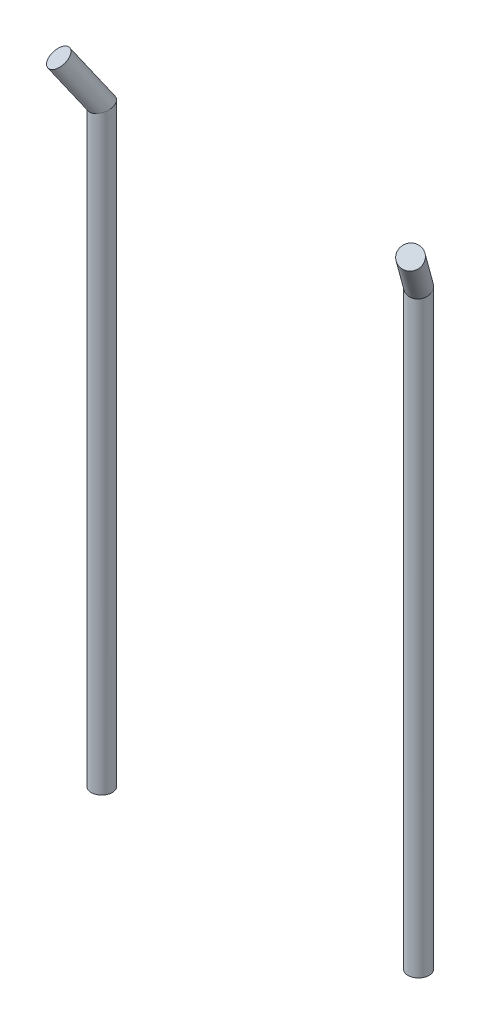
ISO-10303-21;
HEADER;
FILE_DESCRIPTION(('STEP AP214'),'2;1');
FILE_NAME('part.step','',(''),(''),'','','');
FILE_SCHEMA(('AUTOMOTIVE_DESIGN { 1 0 10303 214 1 1 1 1 }'));
ENDSEC;
DATA;
#1=APPLICATION_CONTEXT('core data for automotive mechanical design processes');
#2=APPLICATION_PROTOCOL_DEFINITION('international standard','automotive_design',2000,#1);
#3=PRODUCT_CONTEXT('',#1,'mechanical');
#4=PRODUCT('Part','Part','',(#3));
#5=PRODUCT_RELATED_PRODUCT_CATEGORY('part','',(#4));
#6=PRODUCT_DEFINITION_FORMATION('','',#4);
#7=PRODUCT_DEFINITION_CONTEXT('part definition',#1,'design');
#8=PRODUCT_DEFINITION('design','',#6,#7);
#9=PRODUCT_DEFINITION_SHAPE('','',#8);
#10=(LENGTH_UNIT() NAMED_UNIT(*) SI_UNIT(.MILLI.,.METRE.));
#11=(NAMED_UNIT(*) PLANE_ANGLE_UNIT() SI_UNIT($,.RADIAN.));
#12=(NAMED_UNIT(*) SI_UNIT($,.STERADIAN.) SOLID_ANGLE_UNIT());
#13=UNCERTAINTY_MEASURE_WITH_UNIT(LENGTH_MEASURE(1.E-05),#10,'distance_accuracy_value','');
#14=(GEOMETRIC_REPRESENTATION_CONTEXT(3) GLOBAL_UNCERTAINTY_ASSIGNED_CONTEXT((#13)) GLOBAL_UNIT_ASSIGNED_CONTEXT((#10,
#11,#12)) REPRESENTATION_CONTEXT('',''));
#15=CARTESIAN_POINT('',(0.,0.,0.));
#16=DIRECTION('',(0.,0.,1.));
#17=DIRECTION('',(1.,0.,0.));
#18=AXIS2_PLACEMENT_3D('',#15,#16,#17);
#19=CARTESIAN_POINT('',(-8.57683490368659,300.40759438923,11.7823301141345));
#20=DIRECTION('',(0.342020143325674,-0.813797681349371,-0.469846310392956));
#21=DIRECTION('',(0.,0.500000000000003,-0.866025403784437));
#22=AXIS2_PLACEMENT_3D('',#19,#20,#21);
#23=PLANE('',#22);
#24=CARTESIAN_POINT('',(-8.57683490368659,300.40759438923,11.7823301141345));
#25=DIRECTION('',(0.342020143325674,-0.813797681349371,-0.469846310392956));
#26=DIRECTION('',(0.,0.500000000000003,-0.866025403784437));
#27=AXIS2_PLACEMENT_3D('',#24,#25,#26);
#28=CIRCLE('',#27,4.99999999999999);
#29=CARTESIAN_POINT('',(-8.57683490368659,302.90759438923,7.45220309521232));
#30=VERTEX_POINT('',#29);
#31=EDGE_CURVE('E62',#30,#30,#28,.T.);
#32=ORIENTED_EDGE('',*,*,#31,.F.);
#33=EDGE_LOOP('',(#32));
#34=FACE_BOUND('',#33,.T.);
#35=ADVANCED_FACE('F59',(#34),#23,.F.);
#36=CARTESIAN_POINT('',(0.,0.,0.));
#37=DIRECTION('',(0.,-1.,0.));
#38=DIRECTION('',(0.0942828813937039,0.,-0.995545447619596));
#39=AXIS2_PLACEMENT_3D('',#36,#37,#38);
#40=PLANE('',#39);
#41=CARTESIAN_POINT('',(0.,0.,0.));
#42=DIRECTION('',(0.,-1.,0.));
#43=DIRECTION('',(0.0942828813937039,0.,-0.995545447619596));
#44=AXIS2_PLACEMENT_3D('',#41,#42,#43);
#45=CIRCLE('',#44,4.99999999999999);
#46=CARTESIAN_POINT('',(0.471414406968547,0.,-4.97772723809794));
#47=VERTEX_POINT('',#46);
#48=EDGE_CURVE('E67',#47,#47,#45,.T.);
#49=ORIENTED_EDGE('',*,*,#48,.T.);
#50=EDGE_LOOP('',(#49));
#51=FACE_BOUND('',#50,.T.);
#52=ADVANCED_FACE('F83',(#51),#40,.T.);
#53=CARTESIAN_POINT('',(1.16713895716854,277.22292679045,-1.60334396509311));
#54=DIRECTION('',(-0.342020143325673,0.813797681349371,0.469846310392955));
#55=DIRECTION('',(0.,-0.500000000000002,0.866025403784438));
#56=AXIS2_PLACEMENT_3D('',#53,#54,#55);
#57=CYLINDRICAL_SURFACE('',#56,4.99999999999999);
#58=CARTESIAN_POINT('',(0.,280.,0.));
#59=DIRECTION('',(-0.179573507532241,0.952312365074971,0.246687078538546));
#60=DIRECTION('',(0.560459383169203,0.30512482580956,-0.769924749889418));
#61=AXIS2_PLACEMENT_3D('',#58,#59,#60);
#62=ELLIPSE('',#61,5.25037811475478,4.99999999999999);
#63=CARTESIAN_POINT('',(2.94262367960057,281.602020707699,-4.04239605682741));
#64=VERTEX_POINT('',#63);
#65=EDGE_CURVE('E13',#64,#64,#62,.T.);
#66=ORIENTED_EDGE('',*,*,#65,.T.);
#67=EDGE_LOOP('',(#66));
#68=FACE_BOUND('',#67,.T.);
#69=ORIENTED_EDGE('',*,*,#31,.T.);
#70=EDGE_LOOP('',(#69));
#71=FACE_BOUND('',#70,.T.);
#72=ADVANCED_FACE('F81',(#68,#71),#57,.T.);
#73=CARTESIAN_POINT('',(0.,0.,0.));
#74=DIRECTION('',(0.,1.,0.));
#75=DIRECTION('',(0.,0.,1.));
#76=AXIS2_PLACEMENT_3D('',#73,#74,#75);
#77=CYLINDRICAL_SURFACE('',#76,4.99999999999999);
#78=ORIENTED_EDGE('',*,*,#48,.F.);
#79=EDGE_LOOP('',(#78));
#80=FACE_BOUND('',#79,.T.);
#81=ORIENTED_EDGE('',*,*,#65,.F.);
#82=EDGE_LOOP('',(#81));
#83=FACE_BOUND('',#82,.T.);
#84=ADVANCED_FACE('F79',(#80,#83),#77,.T.);
#85=CLOSED_SHELL('',(#35,#52,#72,#84));
#86=MANIFOLD_SOLID_BREP('B2',#85);
#87=CARTESIAN_POINT('',(150.,0.,0.));
#88=DIRECTION('',(0.,1.,0.));
#89=DIRECTION('',(0.,0.,1.));
#90=AXIS2_PLACEMENT_3D('',#87,#88,#89);
#91=PLANE('',#90);
#92=CARTESIAN_POINT('',(150.,0.,0.));
#93=DIRECTION('',(0.,1.,0.));
#94=DIRECTION('',(0.,0.,1.));
#95=AXIS2_PLACEMENT_3D('',#92,#93,#94);
#96=CIRCLE('',#95,5.);
#97=CARTESIAN_POINT('',(150.,0.,4.99999999999999));
#98=VERTEX_POINT('',#97);
#99=EDGE_CURVE('E122',#98,#98,#96,.T.);
#100=ORIENTED_EDGE('',*,*,#99,.F.);
#101=EDGE_LOOP('',(#100));
#102=FACE_BOUND('',#101,.T.);
#103=ADVANCED_FACE('F119',(#102),#91,.F.);
#104=CARTESIAN_POINT('',(160.147861706206,304.145672377257,13.9405104467738));
#105=DIRECTION('',(0.342020143325673,0.813797681349371,0.469846310392954));
#106=DIRECTION('',(-0.088596927912096,-0.469846310392954,0.878290970564235));
#107=AXIS2_PLACEMENT_3D('',#104,#105,#106);
#108=PLANE('',#107);
#109=CARTESIAN_POINT('',(160.147861706206,304.145672377257,13.9405104467738));
#110=DIRECTION('',(0.342020143325673,0.813797681349371,0.469846310392954));
#111=DIRECTION('',(-0.088596927912096,-0.469846310392954,0.878290970564235));
#112=AXIS2_PLACEMENT_3D('',#109,#110,#111);
#113=CIRCLE('',#112,5.);
#114=CARTESIAN_POINT('',(159.704877066645,301.796440825292,18.331965299595));
#115=VERTEX_POINT('',#114);
#116=EDGE_CURVE('E127',#115,#115,#113,.T.);
#117=ORIENTED_EDGE('',*,*,#116,.T.);
#118=EDGE_LOOP('',(#117));
#119=FACE_BOUND('',#118,.T.);
#120=ADVANCED_FACE('F143',(#119),#108,.T.);
#121=CARTESIAN_POINT('',(150.,283.598943872848,0.));
#122=DIRECTION('',(0.,-1.,0.));
#123=DIRECTION('',(0.,0.,-1.));
#124=AXIS2_PLACEMENT_3D('',#121,#122,#123);
#125=CYLINDRICAL_SURFACE('',#124,5.);
#126=CARTESIAN_POINT('',(150.,280.,0.));
#127=DIRECTION('',(-0.179573507532241,-0.952312365074972,-0.246687078538545));
#128=DIRECTION('',(-0.560459383169204,0.30512482580956,-0.769924749889417));
#129=AXIS2_PLACEMENT_3D('',#126,#127,#128);
#130=ELLIPSE('',#129,5.25037811475479,5.);
#131=CARTESIAN_POINT('',(147.057376320399,281.602020707699,-4.04239605682751));
#132=VERTEX_POINT('',#131);
#133=EDGE_CURVE('E57',#132,#132,#130,.T.);
#134=ORIENTED_EDGE('',*,*,#133,.T.);
#135=EDGE_LOOP('',(#134));
#136=FACE_BOUND('',#135,.T.);
#137=ORIENTED_EDGE('',*,*,#99,.T.);
#138=EDGE_LOOP('',(#137));
#139=FACE_BOUND('',#138,.T.);
#140=ADVANCED_FACE('F141',(#136,#139),#125,.T.);
#141=CARTESIAN_POINT('',(160.147861706206,304.145672377257,13.9405104467738));
#142=DIRECTION('',(-0.342020143325673,-0.813797681349372,-0.469846310392954));
#143=DIRECTION('',(0.,0.500000000000001,-0.866025403784438));
#144=AXIS2_PLACEMENT_3D('',#141,#142,#143);
#145=CYLINDRICAL_SURFACE('',#144,5.);
#146=ORIENTED_EDGE('',*,*,#116,.F.);
#147=EDGE_LOOP('',(#146));
#148=FACE_BOUND('',#147,.T.);
#149=ORIENTED_EDGE('',*,*,#133,.F.);
#150=EDGE_LOOP('',(#149));
#151=FACE_BOUND('',#150,.T.);
#152=ADVANCED_FACE('F139',(#148,#151),#145,.T.);
#153=CLOSED_SHELL('',(#103,#120,#140,#152));
#154=MANIFOLD_SOLID_BREP('B7',#153);
#155=ADVANCED_BREP_SHAPE_REPRESENTATION('',(#18,#86,#154),#14);
#156=SHAPE_DEFINITION_REPRESENTATION(#9,#155);
ENDSEC;
END-ISO-10303-21;
